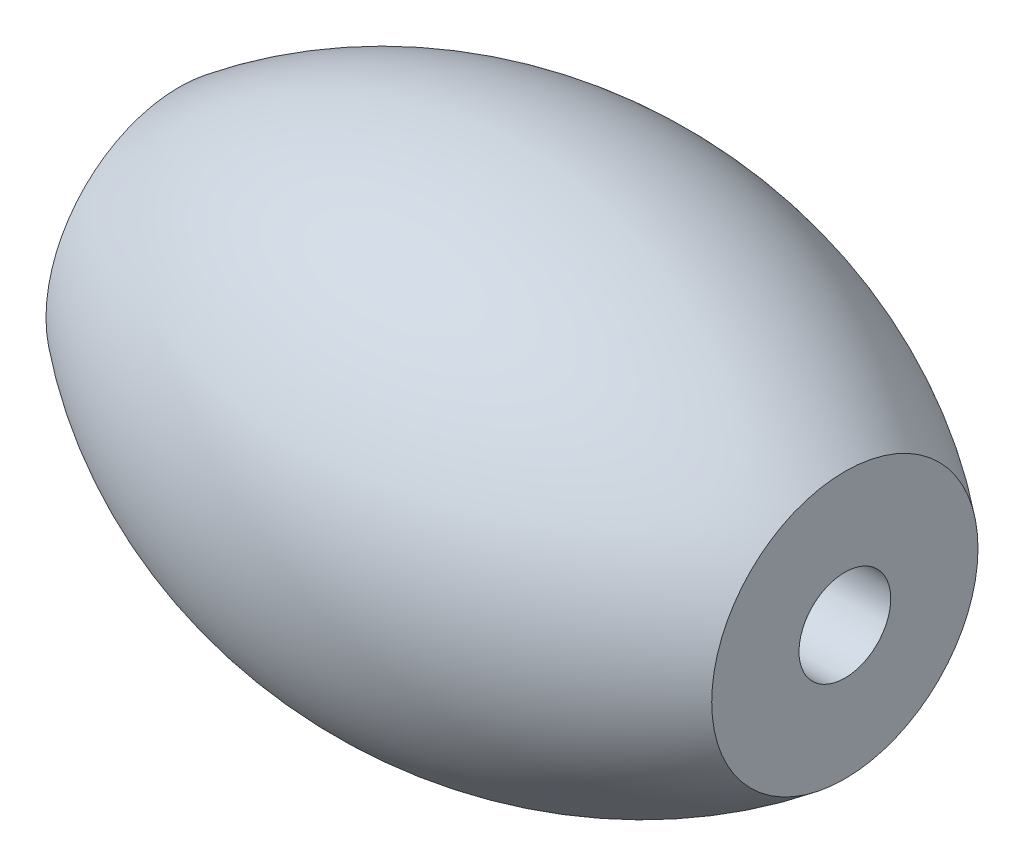
ISO-10303-21;
HEADER;
FILE_DESCRIPTION(('STEP AP214'),'2;1');
FILE_NAME('part.step','',(''),(''),'','','');
FILE_SCHEMA(('AUTOMOTIVE_DESIGN { 1 0 10303 214 1 1 1 1 }'));
ENDSEC;
DATA;
#1=APPLICATION_CONTEXT('core data for automotive mechanical design processes');
#2=APPLICATION_PROTOCOL_DEFINITION('international standard','automotive_design',2000,#1);
#3=PRODUCT_CONTEXT('',#1,'mechanical');
#4=PRODUCT('Part','Part','',(#3));
#5=PRODUCT_RELATED_PRODUCT_CATEGORY('part','',(#4));
#6=PRODUCT_DEFINITION_FORMATION('','',#4);
#7=PRODUCT_DEFINITION_CONTEXT('part definition',#1,'design');
#8=PRODUCT_DEFINITION('design','',#6,#7);
#9=PRODUCT_DEFINITION_SHAPE('','',#8);
#10=(LENGTH_UNIT() NAMED_UNIT(*) SI_UNIT(.MILLI.,.METRE.));
#11=(NAMED_UNIT(*) PLANE_ANGLE_UNIT() SI_UNIT($,.RADIAN.));
#12=(NAMED_UNIT(*) SI_UNIT($,.STERADIAN.) SOLID_ANGLE_UNIT());
#13=UNCERTAINTY_MEASURE_WITH_UNIT(LENGTH_MEASURE(1.E-05),#10,'distance_accuracy_value','');
#14=(GEOMETRIC_REPRESENTATION_CONTEXT(3) GLOBAL_UNCERTAINTY_ASSIGNED_CONTEXT((#13)) GLOBAL_UNIT_ASSIGNED_CONTEXT((#10,
#11,#12)) REPRESENTATION_CONTEXT('',''));
#15=CARTESIAN_POINT('',(0.,0.,0.));
#16=DIRECTION('',(0.,0.,1.));
#17=DIRECTION('',(1.,0.,0.));
#18=AXIS2_PLACEMENT_3D('',#15,#16,#17);
#19=CARTESIAN_POINT('',(12.7,0.,0.));
#20=DIRECTION('',(-1.,0.,0.));
#21=DIRECTION('',(0.,-1.,0.));
#22=AXIS2_PLACEMENT_3D('',#19,#20,#21);
#23=DEGENERATE_TOROIDAL_SURFACE('',#22,11.095159453303,20.565159453303,.F.);
#24=CARTESIAN_POINT('',(25.4,0.,0.));
#25=DIRECTION('',(-1.,0.,0.));
#26=DIRECTION('',(0.,-1.,0.));
#27=AXIS2_PLACEMENT_3D('',#24,#25,#26);
#28=CIRCLE('',#27,5.08);
#29=CARTESIAN_POINT('',(25.4,-5.08,0.));
#30=VERTEX_POINT('',#29);
#31=EDGE_CURVE('E62',#30,#30,#28,.T.);
#32=ORIENTED_EDGE('',*,*,#31,.T.);
#33=EDGE_LOOP('',(#32));
#34=FACE_BOUND('',#33,.T.);
#35=CARTESIAN_POINT('',(0.,0.,0.));
#36=DIRECTION('',(-1.,0.,0.));
#37=DIRECTION('',(0.,-1.,0.));
#38=AXIS2_PLACEMENT_3D('',#35,#36,#37);
#39=CIRCLE('',#38,5.08);
#40=CARTESIAN_POINT('',(0.,-5.08,0.));
#41=VERTEX_POINT('',#40);
#42=EDGE_CURVE('E10',#41,#41,#39,.T.);
#43=ORIENTED_EDGE('',*,*,#42,.F.);
#44=EDGE_LOOP('',(#43));
#45=FACE_BOUND('',#44,.T.);
#46=ADVANCED_FACE('F45',(#34,#45),#23,.F.);
#47=CARTESIAN_POINT('',(0.,0.,0.));
#48=DIRECTION('',(1.,0.,0.));
#49=DIRECTION('',(0.,1.,0.));
#50=AXIS2_PLACEMENT_3D('',#47,#48,#49);
#51=PLANE('',#50);
#52=CARTESIAN_POINT('',(0.,0.,0.));
#53=DIRECTION('',(-1.,0.,0.));
#54=DIRECTION('',(0.,-1.,0.));
#55=AXIS2_PLACEMENT_3D('',#52,#53,#54);
#56=CIRCLE('',#55,1.75);
#57=CARTESIAN_POINT('',(0.,-1.75,0.));
#58=VERTEX_POINT('',#57);
#59=EDGE_CURVE('E52',#58,#58,#56,.T.);
#60=ORIENTED_EDGE('',*,*,#59,.F.);
#61=EDGE_LOOP('',(#60));
#62=FACE_BOUND('',#61,.T.);
#63=ORIENTED_EDGE('',*,*,#42,.T.);
#64=EDGE_LOOP('',(#63));
#65=FACE_BOUND('',#64,.T.);
#66=ADVANCED_FACE('F79',(#62,#65),#51,.F.);
#67=CARTESIAN_POINT('',(0.,0.,0.));
#68=DIRECTION('',(-1.,0.,0.));
#69=DIRECTION('',(0.,-1.,0.));
#70=AXIS2_PLACEMENT_3D('',#67,#68,#69);
#71=CYLINDRICAL_SURFACE('',#70,1.75);
#72=CARTESIAN_POINT('',(25.4,0.,0.));
#73=DIRECTION('',(-1.,0.,0.));
#74=DIRECTION('',(0.,-1.,0.));
#75=AXIS2_PLACEMENT_3D('',#72,#73,#74);
#76=CIRCLE('',#75,1.75);
#77=CARTESIAN_POINT('',(25.4,-1.75,0.));
#78=VERTEX_POINT('',#77);
#79=EDGE_CURVE('E57',#78,#78,#76,.T.);
#80=ORIENTED_EDGE('',*,*,#79,.F.);
#81=EDGE_LOOP('',(#80));
#82=FACE_BOUND('',#81,.T.);
#83=ORIENTED_EDGE('',*,*,#59,.T.);
#84=EDGE_LOOP('',(#83));
#85=FACE_BOUND('',#84,.T.);
#86=ADVANCED_FACE('F73',(#82,#85),#71,.F.);
#87=CARTESIAN_POINT('',(25.4,0.,0.));
#88=DIRECTION('',(1.,0.,0.));
#89=DIRECTION('',(0.,1.,0.));
#90=AXIS2_PLACEMENT_3D('',#87,#88,#89);
#91=PLANE('',#90);
#92=ORIENTED_EDGE('',*,*,#79,.T.);
#93=EDGE_LOOP('',(#92));
#94=FACE_BOUND('',#93,.T.);
#95=ORIENTED_EDGE('',*,*,#31,.F.);
#96=EDGE_LOOP('',(#95));
#97=FACE_BOUND('',#96,.T.);
#98=ADVANCED_FACE('F71',(#94,#97),#91,.T.);
#99=CLOSED_SHELL('',(#46,#66,#86,#98));
#100=MANIFOLD_SOLID_BREP('B2',#99);
#101=ADVANCED_BREP_SHAPE_REPRESENTATION('',(#18,#100),#14);
#102=SHAPE_DEFINITION_REPRESENTATION(#9,#101);
ENDSEC;
END-ISO-10303-21;
